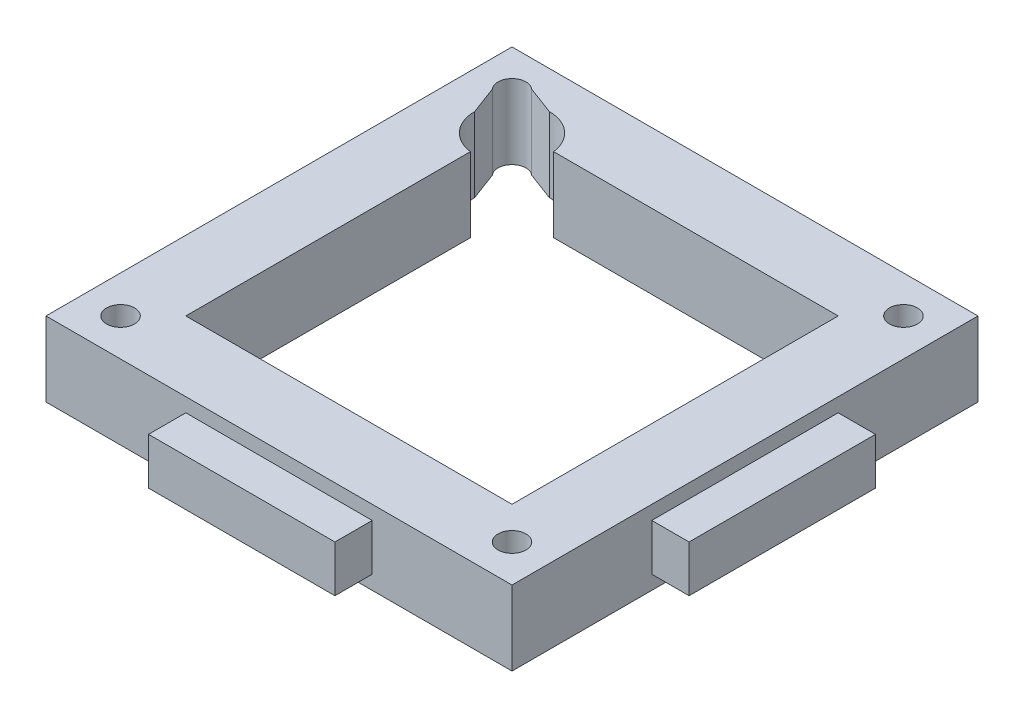
ISO-10303-21;
HEADER;
FILE_DESCRIPTION(('STEP AP214'),'2;1');
FILE_NAME('part.step','',(''),(''),'','','');
FILE_SCHEMA(('AUTOMOTIVE_DESIGN { 1 0 10303 214 1 1 1 1 }'));
ENDSEC;
DATA;
#1=APPLICATION_CONTEXT('core data for automotive mechanical design processes');
#2=APPLICATION_PROTOCOL_DEFINITION('international standard','automotive_design',2000,#1);
#3=PRODUCT_CONTEXT('',#1,'mechanical');
#4=PRODUCT('Part','Part','',(#3));
#5=PRODUCT_RELATED_PRODUCT_CATEGORY('part','',(#4));
#6=PRODUCT_DEFINITION_FORMATION('','',#4);
#7=PRODUCT_DEFINITION_CONTEXT('part definition',#1,'design');
#8=PRODUCT_DEFINITION('design','',#6,#7);
#9=PRODUCT_DEFINITION_SHAPE('','',#8);
#10=(LENGTH_UNIT() NAMED_UNIT(*) SI_UNIT(.MILLI.,.METRE.));
#11=(NAMED_UNIT(*) PLANE_ANGLE_UNIT() SI_UNIT($,.RADIAN.));
#12=(NAMED_UNIT(*) SI_UNIT($,.STERADIAN.) SOLID_ANGLE_UNIT());
#13=UNCERTAINTY_MEASURE_WITH_UNIT(LENGTH_MEASURE(1.E-05),#10,'distance_accuracy_value','');
#14=(GEOMETRIC_REPRESENTATION_CONTEXT(3) GLOBAL_UNCERTAINTY_ASSIGNED_CONTEXT((#13)) GLOBAL_UNIT_ASSIGNED_CONTEXT((#10,
#11,#12)) REPRESENTATION_CONTEXT('',''));
#15=CARTESIAN_POINT('',(0.,0.,0.));
#16=DIRECTION('',(0.,0.,1.));
#17=DIRECTION('',(1.,0.,0.));
#18=AXIS2_PLACEMENT_3D('',#15,#16,#17);
#19=CARTESIAN_POINT('',(25.,8.,0.));
#20=DIRECTION('',(-1.,0.,0.));
#21=DIRECTION('',(0.,0.,1.));
#22=AXIS2_PLACEMENT_3D('',#19,#20,#21);
#23=PLANE('',#22);
#24=DIRECTION('',(0.,0.,-1.));
#25=VECTOR('',#24,1.);
#26=CARTESIAN_POINT('',(25.,0.,0.));
#27=LINE('',#26,#25);
#28=CARTESIAN_POINT('',(25.,0.,25.));
#29=VERTEX_POINT('',#28);
#30=CARTESIAN_POINT('',(25.,0.,-25.));
#31=VERTEX_POINT('',#30);
#32=EDGE_CURVE('E438',#29,#31,#27,.T.);
#33=ORIENTED_EDGE('',*,*,#32,.T.);
#34=DIRECTION('',(0.,-1.,0.));
#35=VECTOR('',#34,1.);
#36=CARTESIAN_POINT('',(25.,8.,-25.));
#37=LINE('',#36,#35);
#38=CARTESIAN_POINT('',(25.,8.,-25.));
#39=VERTEX_POINT('',#38);
#40=EDGE_CURVE('E59',#39,#31,#37,.T.);
#41=ORIENTED_EDGE('',*,*,#40,.F.);
#42=DIRECTION('',(0.,0.,-1.));
#43=VECTOR('',#42,1.);
#44=CARTESIAN_POINT('',(25.,8.,0.));
#45=LINE('',#44,#43);
#46=CARTESIAN_POINT('',(25.,8.,25.));
#47=VERTEX_POINT('',#46);
#48=EDGE_CURVE('E378',#47,#39,#45,.T.);
#49=ORIENTED_EDGE('',*,*,#48,.F.);
#50=DIRECTION('',(0.,-1.,0.));
#51=VECTOR('',#50,1.);
#52=CARTESIAN_POINT('',(25.,8.,25.));
#53=LINE('',#52,#51);
#54=EDGE_CURVE('E11',#47,#29,#53,.T.);
#55=ORIENTED_EDGE('',*,*,#54,.T.);
#56=EDGE_LOOP('',(#33,#41,#49,#55));
#57=FACE_BOUND('',#56,.T.);
#58=DIRECTION('',(0.,0.,-1.));
#59=VECTOR('',#58,1.);
#60=CARTESIAN_POINT('',(25.,1.50000000000004,0.));
#61=LINE('',#60,#59);
#62=CARTESIAN_POINT('',(25.,1.5,10.));
#63=VERTEX_POINT('',#62);
#64=CARTESIAN_POINT('',(25.,1.50000000000007,-10.));
#65=VERTEX_POINT('',#64);
#66=EDGE_CURVE('E67',#63,#65,#61,.T.);
#67=ORIENTED_EDGE('',*,*,#66,.F.);
#68=DIRECTION('',(0.,-1.,0.));
#69=VECTOR('',#68,1.);
#70=CARTESIAN_POINT('',(25.,8.,10.));
#71=LINE('',#70,#69);
#72=CARTESIAN_POINT('',(25.,6.5,10.));
#73=VERTEX_POINT('',#72);
#74=EDGE_CURVE('E71',#73,#63,#71,.T.);
#75=ORIENTED_EDGE('',*,*,#74,.F.);
#76=DIRECTION('',(0.,0.,1.));
#77=VECTOR('',#76,1.);
#78=CARTESIAN_POINT('',(25.,6.5,0.));
#79=LINE('',#78,#77);
#80=CARTESIAN_POINT('',(25.,6.5,-10.));
#81=VERTEX_POINT('',#80);
#82=EDGE_CURVE('E1005',#81,#73,#79,.T.);
#83=ORIENTED_EDGE('',*,*,#82,.F.);
#84=DIRECTION('',(0.,1.,0.));
#85=VECTOR('',#84,1.);
#86=CARTESIAN_POINT('',(25.,8.,-10.));
#87=LINE('',#86,#85);
#88=EDGE_CURVE('E1015',#65,#81,#87,.T.);
#89=ORIENTED_EDGE('',*,*,#88,.F.);
#90=EDGE_LOOP('',(#67,#75,#83,#89));
#91=FACE_BOUND('',#90,.T.);
#92=ADVANCED_FACE('F49',(#57,#91),#23,.F.);
#93=CARTESIAN_POINT('',(0.,8.,25.));
#94=DIRECTION('',(0.,0.,-1.));
#95=DIRECTION('',(-1.,0.,0.));
#96=AXIS2_PLACEMENT_3D('',#93,#94,#95);
#97=PLANE('',#96);
#98=DIRECTION('',(1.,0.,0.));
#99=VECTOR('',#98,1.);
#100=CARTESIAN_POINT('',(0.,0.,25.));
#101=LINE('',#100,#99);
#102=CARTESIAN_POINT('',(-25.,0.,25.));
#103=VERTEX_POINT('',#102);
#104=EDGE_CURVE('E434',#103,#29,#101,.T.);
#105=ORIENTED_EDGE('',*,*,#104,.T.);
#106=ORIENTED_EDGE('',*,*,#54,.F.);
#107=DIRECTION('',(1.,0.,0.));
#108=VECTOR('',#107,1.);
#109=CARTESIAN_POINT('',(0.,8.,25.));
#110=LINE('',#109,#108);
#111=CARTESIAN_POINT('',(-25.,8.,25.));
#112=VERTEX_POINT('',#111);
#113=EDGE_CURVE('E374',#112,#47,#110,.T.);
#114=ORIENTED_EDGE('',*,*,#113,.F.);
#115=DIRECTION('',(0.,-1.,0.));
#116=VECTOR('',#115,1.);
#117=CARTESIAN_POINT('',(-25.,8.,25.));
#118=LINE('',#117,#116);
#119=EDGE_CURVE('E457',#112,#103,#118,.T.);
#120=ORIENTED_EDGE('',*,*,#119,.T.);
#121=EDGE_LOOP('',(#105,#106,#114,#120));
#122=FACE_BOUND('',#121,.T.);
#123=DIRECTION('',(1.,0.,0.));
#124=VECTOR('',#123,1.);
#125=CARTESIAN_POINT('',(0.,1.5000000000053,25.));
#126=LINE('',#125,#124);
#127=CARTESIAN_POINT('',(-10.0000000000553,1.5000000000053,25.));
#128=VERTEX_POINT('',#127);
#129=CARTESIAN_POINT('',(9.9999999999447,1.5000000000053,25.));
#130=VERTEX_POINT('',#129);
#131=EDGE_CURVE('E242',#128,#130,#126,.T.);
#132=ORIENTED_EDGE('',*,*,#131,.F.);
#133=DIRECTION('',(0.,-1.,0.));
#134=VECTOR('',#133,1.);
#135=CARTESIAN_POINT('',(-10.0000000000553,8.,25.));
#136=LINE('',#135,#134);
#137=CARTESIAN_POINT('',(-10.0000000000553,6.5000000000053,25.));
#138=VERTEX_POINT('',#137);
#139=EDGE_CURVE('E258',#138,#128,#136,.T.);
#140=ORIENTED_EDGE('',*,*,#139,.F.);
#141=DIRECTION('',(-1.,0.,0.));
#142=VECTOR('',#141,1.);
#143=CARTESIAN_POINT('',(0.,6.5000000000053,25.));
#144=LINE('',#143,#142);
#145=CARTESIAN_POINT('',(9.9999999999447,6.5000000000053,25.));
#146=VERTEX_POINT('',#145);
#147=EDGE_CURVE('E271',#146,#138,#144,.T.);
#148=ORIENTED_EDGE('',*,*,#147,.F.);
#149=DIRECTION('',(0.,1.,0.));
#150=VECTOR('',#149,1.);
#151=CARTESIAN_POINT('',(9.9999999999447,8.,25.));
#152=LINE('',#151,#150);
#153=EDGE_CURVE('E247',#130,#146,#152,.T.);
#154=ORIENTED_EDGE('',*,*,#153,.F.);
#155=EDGE_LOOP('',(#132,#140,#148,#154));
#156=FACE_BOUND('',#155,.T.);
#157=ADVANCED_FACE('F545',(#122,#156),#97,.F.);
#158=CARTESIAN_POINT('',(0.,8.,-25.));
#159=DIRECTION('',(0.,0.,-1.));
#160=DIRECTION('',(-1.,0.,0.));
#161=AXIS2_PLACEMENT_3D('',#158,#159,#160);
#162=PLANE('',#161);
#163=DIRECTION('',(1.,0.,0.));
#164=VECTOR('',#163,1.);
#165=CARTESIAN_POINT('',(0.,6.5000000000053,-25.));
#166=LINE('',#165,#164);
#167=CARTESIAN_POINT('',(-10.0000000000553,6.5000000000053,-25.));
#168=VERTEX_POINT('',#167);
#169=CARTESIAN_POINT('',(9.9999999999447,6.5000000000053,-25.));
#170=VERTEX_POINT('',#169);
#171=EDGE_CURVE('E293',#168,#170,#166,.T.);
#172=ORIENTED_EDGE('',*,*,#171,.F.);
#173=DIRECTION('',(0.,1.,0.));
#174=VECTOR('',#173,1.);
#175=CARTESIAN_POINT('',(-10.0000000000553,8.,-25.));
#176=LINE('',#175,#174);
#177=CARTESIAN_POINT('',(-10.0000000000553,1.5000000000053,-25.));
#178=VERTEX_POINT('',#177);
#179=EDGE_CURVE('E299',#178,#168,#176,.T.);
#180=ORIENTED_EDGE('',*,*,#179,.F.);
#181=DIRECTION('',(-1.,0.,0.));
#182=VECTOR('',#181,1.);
#183=CARTESIAN_POINT('',(0.,1.5000000000053,-25.));
#184=LINE('',#183,#182);
#185=CARTESIAN_POINT('',(9.9999999999447,1.5000000000053,-25.));
#186=VERTEX_POINT('',#185);
#187=EDGE_CURVE('E318',#186,#178,#184,.T.);
#188=ORIENTED_EDGE('',*,*,#187,.F.);
#189=DIRECTION('',(0.,-1.,0.));
#190=VECTOR('',#189,1.);
#191=CARTESIAN_POINT('',(9.9999999999447,8.,-25.));
#192=LINE('',#191,#190);
#193=EDGE_CURVE('E314',#170,#186,#192,.T.);
#194=ORIENTED_EDGE('',*,*,#193,.F.);
#195=EDGE_LOOP('',(#172,#180,#188,#194));
#196=FACE_BOUND('',#195,.T.);
#197=DIRECTION('',(1.,0.,0.));
#198=VECTOR('',#197,1.);
#199=CARTESIAN_POINT('',(0.,0.,-25.));
#200=LINE('',#199,#198);
#201=CARTESIAN_POINT('',(-25.,0.,-25.));
#202=VERTEX_POINT('',#201);
#203=EDGE_CURVE('E442',#202,#31,#200,.T.);
#204=ORIENTED_EDGE('',*,*,#203,.F.);
#205=DIRECTION('',(0.,-1.,0.));
#206=VECTOR('',#205,1.);
#207=CARTESIAN_POINT('',(-25.,8.,-25.));
#208=LINE('',#207,#206);
#209=CARTESIAN_POINT('',(-25.,8.,-25.));
#210=VERTEX_POINT('',#209);
#211=EDGE_CURVE('E460',#210,#202,#208,.T.);
#212=ORIENTED_EDGE('',*,*,#211,.F.);
#213=DIRECTION('',(1.,0.,0.));
#214=VECTOR('',#213,1.);
#215=CARTESIAN_POINT('',(0.,8.,-25.));
#216=LINE('',#215,#214);
#217=EDGE_CURVE('E381',#210,#39,#216,.T.);
#218=ORIENTED_EDGE('',*,*,#217,.T.);
#219=ORIENTED_EDGE('',*,*,#40,.T.);
#220=EDGE_LOOP('',(#204,#212,#218,#219));
#221=FACE_BOUND('',#220,.T.);
#222=ADVANCED_FACE('F543',(#196,#221),#162,.T.);
#223=CARTESIAN_POINT('',(-17.,8.,-17.));
#224=DIRECTION('',(0.,-1.,0.));
#225=DIRECTION('',(0.,0.,-1.));
#226=AXIS2_PLACEMENT_3D('',#223,#224,#225);
#227=CYLINDRICAL_SURFACE('',#226,4.);
#228=CARTESIAN_POINT('',(-17.,0.,-17.));
#229=DIRECTION('',(0.,1.,0.));
#230=DIRECTION('',(0.,0.,1.));
#231=AXIS2_PLACEMENT_3D('',#228,#229,#230);
#232=CIRCLE('',#231,4.);
#233=CARTESIAN_POINT('',(-13.0313730334031,0.,-17.5));
#234=VERTEX_POINT('',#233);
#235=CARTESIAN_POINT('',(-17.,0.,-21.));
#236=VERTEX_POINT('',#235);
#237=EDGE_CURVE('E328',#234,#236,#232,.T.);
#238=ORIENTED_EDGE('',*,*,#237,.F.);
#239=DIRECTION('',(0.,-1.,0.));
#240=VECTOR('',#239,1.);
#241=CARTESIAN_POINT('',(-13.0313730334031,8.,-17.5));
#242=LINE('',#241,#240);
#243=CARTESIAN_POINT('',(-13.0313730334031,8.,-17.5));
#244=VERTEX_POINT('',#243);
#245=EDGE_CURVE('E53',#244,#234,#242,.T.);
#246=ORIENTED_EDGE('',*,*,#245,.F.);
#247=CARTESIAN_POINT('',(-17.,8.,-17.));
#248=DIRECTION('',(0.,1.,0.));
#249=DIRECTION('',(0.,0.,1.));
#250=AXIS2_PLACEMENT_3D('',#247,#248,#249);
#251=CIRCLE('',#250,4.);
#252=CARTESIAN_POINT('',(-17.,8.,-21.));
#253=VERTEX_POINT('',#252);
#254=EDGE_CURVE('E338',#244,#253,#251,.T.);
#255=ORIENTED_EDGE('',*,*,#254,.T.);
#256=DIRECTION('',(0.,-1.,0.));
#257=VECTOR('',#256,1.);
#258=CARTESIAN_POINT('',(-17.,8.,-21.));
#259=LINE('',#258,#257);
#260=EDGE_CURVE('E397',#253,#236,#259,.T.);
#261=ORIENTED_EDGE('',*,*,#260,.T.);
#262=EDGE_LOOP('',(#238,#246,#255,#261));
#263=FACE_BOUND('',#262,.T.);
#264=ADVANCED_FACE('F495',(#263),#227,.F.);
#265=CARTESIAN_POINT('',(0.,8.,-17.5));
#266=DIRECTION('',(0.,0.,1.));
#267=DIRECTION('',(1.,0.,0.));
#268=AXIS2_PLACEMENT_3D('',#265,#266,#267);
#269=PLANE('',#268);
#270=DIRECTION('',(-1.,0.,0.));
#271=VECTOR('',#270,1.);
#272=CARTESIAN_POINT('',(0.,0.,-17.5));
#273=LINE('',#272,#271);
#274=CARTESIAN_POINT('',(17.5,0.,-17.5));
#275=VERTEX_POINT('',#274);
#276=EDGE_CURVE('E401',#275,#234,#273,.T.);
#277=ORIENTED_EDGE('',*,*,#276,.F.);
#278=DIRECTION('',(0.,-1.,0.));
#279=VECTOR('',#278,1.);
#280=CARTESIAN_POINT('',(17.5,8.,-17.5));
#281=LINE('',#280,#279);
#282=CARTESIAN_POINT('',(17.5,8.,-17.5));
#283=VERTEX_POINT('',#282);
#284=EDGE_CURVE('E484',#283,#275,#281,.T.);
#285=ORIENTED_EDGE('',*,*,#284,.F.);
#286=DIRECTION('',(-1.,0.,0.));
#287=VECTOR('',#286,1.);
#288=CARTESIAN_POINT('',(0.,8.,-17.5));
#289=LINE('',#288,#287);
#290=EDGE_CURVE('E342',#283,#244,#289,.T.);
#291=ORIENTED_EDGE('',*,*,#290,.T.);
#292=ORIENTED_EDGE('',*,*,#245,.T.);
#293=EDGE_LOOP('',(#277,#285,#291,#292));
#294=FACE_BOUND('',#293,.T.);
#295=ADVANCED_FACE('F51',(#294),#269,.T.);
#296=CARTESIAN_POINT('',(17.5,8.,0.));
#297=DIRECTION('',(-1.,0.,0.));
#298=DIRECTION('',(0.,0.,1.));
#299=AXIS2_PLACEMENT_3D('',#296,#297,#298);
#300=PLANE('',#299);
#301=DIRECTION('',(0.,0.,-1.));
#302=VECTOR('',#301,1.);
#303=CARTESIAN_POINT('',(17.5,0.,0.));
#304=LINE('',#303,#302);
#305=CARTESIAN_POINT('',(17.5,0.,17.5));
#306=VERTEX_POINT('',#305);
#307=EDGE_CURVE('E406',#306,#275,#304,.T.);
#308=ORIENTED_EDGE('',*,*,#307,.F.);
#309=DIRECTION('',(0.,-1.,0.));
#310=VECTOR('',#309,1.);
#311=CARTESIAN_POINT('',(17.5,8.,17.5));
#312=LINE('',#311,#310);
#313=CARTESIAN_POINT('',(17.5,8.,17.5));
#314=VERTEX_POINT('',#313);
#315=EDGE_CURVE('E482',#314,#306,#312,.T.);
#316=ORIENTED_EDGE('',*,*,#315,.F.);
#317=DIRECTION('',(0.,0.,-1.));
#318=VECTOR('',#317,1.);
#319=CARTESIAN_POINT('',(17.5,8.,0.));
#320=LINE('',#319,#318);
#321=EDGE_CURVE('E348',#314,#283,#320,.T.);
#322=ORIENTED_EDGE('',*,*,#321,.T.);
#323=ORIENTED_EDGE('',*,*,#284,.T.);
#324=EDGE_LOOP('',(#308,#316,#322,#323));
#325=FACE_BOUND('',#324,.T.);
#326=ADVANCED_FACE('F503',(#325),#300,.T.);
#327=CARTESIAN_POINT('',(0.,8.,17.5));
#328=DIRECTION('',(0.,0.,-1.));
#329=DIRECTION('',(-1.,0.,0.));
#330=AXIS2_PLACEMENT_3D('',#327,#328,#329);
#331=PLANE('',#330);
#332=DIRECTION('',(1.,0.,0.));
#333=VECTOR('',#332,1.);
#334=CARTESIAN_POINT('',(0.,0.,17.5));
#335=LINE('',#334,#333);
#336=CARTESIAN_POINT('',(-17.5,0.,17.5));
#337=VERTEX_POINT('',#336);
#338=EDGE_CURVE('E410',#337,#306,#335,.T.);
#339=ORIENTED_EDGE('',*,*,#338,.F.);
#340=DIRECTION('',(0.,-1.,0.));
#341=VECTOR('',#340,1.);
#342=CARTESIAN_POINT('',(-17.5,8.,17.5));
#343=LINE('',#342,#341);
#344=CARTESIAN_POINT('',(-17.5,8.,17.5));
#345=VERTEX_POINT('',#344);
#346=EDGE_CURVE('E479',#345,#337,#343,.T.);
#347=ORIENTED_EDGE('',*,*,#346,.F.);
#348=DIRECTION('',(1.,0.,0.));
#349=VECTOR('',#348,1.);
#350=CARTESIAN_POINT('',(0.,8.,17.5));
#351=LINE('',#350,#349);
#352=EDGE_CURVE('E352',#345,#314,#351,.T.);
#353=ORIENTED_EDGE('',*,*,#352,.T.);
#354=ORIENTED_EDGE('',*,*,#315,.T.);
#355=EDGE_LOOP('',(#339,#347,#353,#354));
#356=FACE_BOUND('',#355,.T.);
#357=ADVANCED_FACE('F510',(#356),#331,.T.);
#358=CARTESIAN_POINT('',(-17.5,8.,0.));
#359=DIRECTION('',(-1.,0.,0.));
#360=DIRECTION('',(0.,0.,1.));
#361=AXIS2_PLACEMENT_3D('',#358,#359,#360);
#362=PLANE('',#361);
#363=DIRECTION('',(0.,0.,-1.));
#364=VECTOR('',#363,1.);
#365=CARTESIAN_POINT('',(-17.5,0.,0.));
#366=LINE('',#365,#364);
#367=CARTESIAN_POINT('',(-17.5,0.,-13.0313730334031));
#368=VERTEX_POINT('',#367);
#369=EDGE_CURVE('E414',#337,#368,#366,.T.);
#370=ORIENTED_EDGE('',*,*,#369,.T.);
#371=DIRECTION('',(0.,-1.,0.));
#372=VECTOR('',#371,1.);
#373=CARTESIAN_POINT('',(-17.5,8.,-13.0313730334031));
#374=LINE('',#373,#372);
#375=CARTESIAN_POINT('',(-17.5,8.,-13.0313730334031));
#376=VERTEX_POINT('',#375);
#377=EDGE_CURVE('E476',#376,#368,#374,.T.);
#378=ORIENTED_EDGE('',*,*,#377,.F.);
#379=DIRECTION('',(0.,0.,-1.));
#380=VECTOR('',#379,1.);
#381=CARTESIAN_POINT('',(-17.5,8.,0.));
#382=LINE('',#381,#380);
#383=EDGE_CURVE('E356',#345,#376,#382,.T.);
#384=ORIENTED_EDGE('',*,*,#383,.F.);
#385=ORIENTED_EDGE('',*,*,#346,.T.);
#386=EDGE_LOOP('',(#370,#378,#384,#385));
#387=FACE_BOUND('',#386,.T.);
#388=ADVANCED_FACE('F514',(#387),#362,.F.);
#389=CARTESIAN_POINT('',(-21.,0.,-17.));
#390=VERTEX_POINT('',#389);
#391=EDGE_CURVE('E402',#390,#368,#232,.T.);
#392=ORIENTED_EDGE('',*,*,#391,.F.);
#393=DIRECTION('',(0.,-1.,0.));
#394=VECTOR('',#393,1.);
#395=CARTESIAN_POINT('',(-21.,8.,-17.));
#396=LINE('',#395,#394);
#397=CARTESIAN_POINT('',(-21.,8.,-17.));
#398=VERTEX_POINT('',#397);
#399=EDGE_CURVE('E473',#398,#390,#396,.T.);
#400=ORIENTED_EDGE('',*,*,#399,.F.);
#401=EDGE_CURVE('E344',#398,#376,#251,.T.);
#402=ORIENTED_EDGE('',*,*,#401,.T.);
#403=ORIENTED_EDGE('',*,*,#377,.T.);
#404=EDGE_LOOP('',(#392,#400,#402,#403));
#405=FACE_BOUND('',#404,.T.);
#406=ADVANCED_FACE('F533',(#405),#227,.F.);
#407=CARTESIAN_POINT('',(-12.8219178082192,8.,4.80821917808219));
#408=DIRECTION('',(0.936329177569045,0.,-0.351123441588392));
#409=DIRECTION('',(-0.351123441588392,0.,-0.936329177569045));
#410=AXIS2_PLACEMENT_3D('',#407,#408,#409);
#411=PLANE('',#410);
#412=DIRECTION('',(0.351123441588392,0.,0.936329177569044));
#413=VECTOR('',#412,1.);
#414=CARTESIAN_POINT('',(-12.8219178082192,0.,4.80821917808219));
#415=LINE('',#414,#413);
#416=CARTESIAN_POINT('',(-22.1301369863014,0.,-20.013698630137));
#417=VERTEX_POINT('',#416);
#418=EDGE_CURVE('E418',#417,#390,#415,.T.);
#419=ORIENTED_EDGE('',*,*,#418,.F.);
#420=DIRECTION('',(0.,-1.,0.));
#421=VECTOR('',#420,1.);
#422=CARTESIAN_POINT('',(-22.1301369863014,8.,-20.013698630137));
#423=LINE('',#422,#421);
#424=CARTESIAN_POINT('',(-22.1301369863014,8.,-20.013698630137));
#425=VERTEX_POINT('',#424);
#426=EDGE_CURVE('E470',#425,#417,#423,.T.);
#427=ORIENTED_EDGE('',*,*,#426,.F.);
#428=DIRECTION('',(0.351123441588392,0.,0.936329177569044));
#429=VECTOR('',#428,1.);
#430=CARTESIAN_POINT('',(-12.8219178082192,8.,4.80821917808219));
#431=LINE('',#430,#429);
#432=EDGE_CURVE('E359',#425,#398,#431,.T.);
#433=ORIENTED_EDGE('',*,*,#432,.T.);
#434=ORIENTED_EDGE('',*,*,#399,.T.);
#435=EDGE_LOOP('',(#419,#427,#433,#434));
#436=FACE_BOUND('',#435,.T.);
#437=ADVANCED_FACE('F523',(#436),#411,.T.);
#438=CARTESIAN_POINT('',(-21.,8.,-21.));
#439=DIRECTION('',(0.,-1.,0.));
#440=DIRECTION('',(0.,0.,-1.));
#441=AXIS2_PLACEMENT_3D('',#438,#439,#440);
#442=CYLINDRICAL_SURFACE('',#441,1.5);
#443=CARTESIAN_POINT('',(-21.,0.,-21.));
#444=DIRECTION('',(0.,1.,0.));
#445=DIRECTION('',(0.,0.,1.));
#446=AXIS2_PLACEMENT_3D('',#443,#444,#445);
#447=CIRCLE('',#446,1.5);
#448=CARTESIAN_POINT('',(-20.013698630137,0.,-22.1301369863014));
#449=VERTEX_POINT('',#448);
#450=EDGE_CURVE('E422',#449,#417,#447,.T.);
#451=ORIENTED_EDGE('',*,*,#450,.F.);
#452=DIRECTION('',(0.,-1.,0.));
#453=VECTOR('',#452,1.);
#454=CARTESIAN_POINT('',(-20.013698630137,8.,-22.1301369863014));
#455=LINE('',#454,#453);
#456=CARTESIAN_POINT('',(-20.013698630137,8.,-22.1301369863014));
#457=VERTEX_POINT('',#456);
#458=EDGE_CURVE('E467',#457,#449,#455,.T.);
#459=ORIENTED_EDGE('',*,*,#458,.F.);
#460=CARTESIAN_POINT('',(-21.,8.,-21.));
#461=DIRECTION('',(0.,1.,0.));
#462=DIRECTION('',(0.,0.,1.));
#463=AXIS2_PLACEMENT_3D('',#460,#461,#462);
#464=CIRCLE('',#463,1.5);
#465=EDGE_CURVE('E363',#457,#425,#464,.T.);
#466=ORIENTED_EDGE('',*,*,#465,.T.);
#467=ORIENTED_EDGE('',*,*,#426,.T.);
#468=EDGE_LOOP('',(#451,#459,#466,#467));
#469=FACE_BOUND('',#468,.T.);
#470=ADVANCED_FACE('F527',(#469),#442,.F.);
#471=CARTESIAN_POINT('',(21.,8.,21.));
#472=DIRECTION('',(0.,-1.,0.));
#473=DIRECTION('',(0.,0.,-1.));
#474=AXIS2_PLACEMENT_3D('',#471,#472,#473);
#475=CYLINDRICAL_SURFACE('',#474,1.5);
#476=CARTESIAN_POINT('',(21.,8.,21.));
#477=DIRECTION('',(0.,1.,0.));
#478=DIRECTION('',(0.,0.,1.));
#479=AXIS2_PLACEMENT_3D('',#476,#477,#478);
#480=CIRCLE('',#479,1.5);
#481=CARTESIAN_POINT('',(21.,8.,22.5));
#482=VERTEX_POINT('',#481);
#483=EDGE_CURVE('E389',#482,#482,#480,.T.);
#484=ORIENTED_EDGE('',*,*,#483,.T.);
#485=EDGE_LOOP('',(#484));
#486=FACE_BOUND('',#485,.T.);
#487=CARTESIAN_POINT('',(21.,0.,21.));
#488=DIRECTION('',(0.,1.,0.));
#489=DIRECTION('',(0.,0.,1.));
#490=AXIS2_PLACEMENT_3D('',#487,#488,#489);
#491=CIRCLE('',#490,1.5);
#492=CARTESIAN_POINT('',(21.,0.,22.5));
#493=VERTEX_POINT('',#492);
#494=EDGE_CURVE('E450',#493,#493,#491,.T.);
#495=ORIENTED_EDGE('',*,*,#494,.F.);
#496=EDGE_LOOP('',(#495));
#497=FACE_BOUND('',#496,.T.);
#498=ADVANCED_FACE('F567',(#486,#497),#475,.F.);
#499=CARTESIAN_POINT('',(-25.,8.,0.));
#500=DIRECTION('',(-1.,0.,0.));
#501=DIRECTION('',(0.,0.,1.));
#502=AXIS2_PLACEMENT_3D('',#499,#500,#501);
#503=PLANE('',#502);
#504=DIRECTION('',(0.,0.,-1.));
#505=VECTOR('',#504,1.);
#506=CARTESIAN_POINT('',(-25.,0.,0.));
#507=LINE('',#506,#505);
#508=EDGE_CURVE('E446',#103,#202,#507,.T.);
#509=ORIENTED_EDGE('',*,*,#508,.F.);
#510=ORIENTED_EDGE('',*,*,#119,.F.);
#511=DIRECTION('',(0.,0.,-1.));
#512=VECTOR('',#511,1.);
#513=CARTESIAN_POINT('',(-25.,8.,0.));
#514=LINE('',#513,#512);
#515=EDGE_CURVE('E385',#112,#210,#514,.T.);
#516=ORIENTED_EDGE('',*,*,#515,.T.);
#517=ORIENTED_EDGE('',*,*,#211,.T.);
#518=EDGE_LOOP('',(#509,#510,#516,#517));
#519=FACE_BOUND('',#518,.T.);
#520=ADVANCED_FACE('F561',(#519),#503,.T.);
#521=CARTESIAN_POINT('',(21.,8.,-21.));
#522=DIRECTION('',(0.,-1.,0.));
#523=DIRECTION('',(0.,0.,-1.));
#524=AXIS2_PLACEMENT_3D('',#521,#522,#523);
#525=CYLINDRICAL_SURFACE('',#524,1.5);
#526=CARTESIAN_POINT('',(21.,8.,-21.));
#527=DIRECTION('',(0.,1.,0.));
#528=DIRECTION('',(0.,0.,1.));
#529=AXIS2_PLACEMENT_3D('',#526,#527,#528);
#530=CIRCLE('',#529,1.5);
#531=CARTESIAN_POINT('',(21.,8.,-19.5));
#532=VERTEX_POINT('',#531);
#533=EDGE_CURVE('E370',#532,#532,#530,.F.);
#534=ORIENTED_EDGE('',*,*,#533,.F.);
#535=EDGE_LOOP('',(#534));
#536=FACE_BOUND('',#535,.T.);
#537=CARTESIAN_POINT('',(21.,0.,-21.));
#538=DIRECTION('',(0.,1.,0.));
#539=DIRECTION('',(0.,0.,1.));
#540=AXIS2_PLACEMENT_3D('',#537,#538,#539);
#541=CIRCLE('',#540,1.5);
#542=CARTESIAN_POINT('',(21.,0.,-19.5));
#543=VERTEX_POINT('',#542);
#544=EDGE_CURVE('E430',#543,#543,#541,.F.);
#545=ORIENTED_EDGE('',*,*,#544,.T.);
#546=EDGE_LOOP('',(#545));
#547=FACE_BOUND('',#546,.T.);
#548=ADVANCED_FACE('F558',(#536,#547),#525,.F.);
#549=CARTESIAN_POINT('',(4.80821917808219,8.,-12.8219178082192));
#550=DIRECTION('',(0.351123441588392,0.,-0.936329177569045));
#551=DIRECTION('',(-0.936329177569045,0.,-0.351123441588392));
#552=AXIS2_PLACEMENT_3D('',#549,#550,#551);
#553=PLANE('',#552);
#554=DIRECTION('',(0.936329177569044,0.,0.351123441588392));
#555=VECTOR('',#554,1.);
#556=CARTESIAN_POINT('',(4.80821917808219,0.,-12.8219178082192));
#557=LINE('',#556,#555);
#558=EDGE_CURVE('E426',#449,#236,#557,.T.);
#559=ORIENTED_EDGE('',*,*,#558,.T.);
#560=ORIENTED_EDGE('',*,*,#260,.F.);
#561=DIRECTION('',(0.936329177569044,0.,0.351123441588392));
#562=VECTOR('',#561,1.);
#563=CARTESIAN_POINT('',(4.80821917808219,8.,-12.8219178082192));
#564=LINE('',#563,#562);
#565=EDGE_CURVE('E367',#457,#253,#564,.T.);
#566=ORIENTED_EDGE('',*,*,#565,.F.);
#567=ORIENTED_EDGE('',*,*,#458,.T.);
#568=EDGE_LOOP('',(#559,#560,#566,#567));
#569=FACE_BOUND('',#568,.T.);
#570=ADVANCED_FACE('F530',(#569),#553,.F.);
#571=CARTESIAN_POINT('',(-21.,8.,21.));
#572=DIRECTION('',(0.,-1.,0.));
#573=DIRECTION('',(0.,0.,-1.));
#574=AXIS2_PLACEMENT_3D('',#571,#572,#573);
#575=CYLINDRICAL_SURFACE('',#574,1.5);
#576=CARTESIAN_POINT('',(-21.,8.,21.));
#577=DIRECTION('',(0.,1.,0.));
#578=DIRECTION('',(0.,0.,1.));
#579=AXIS2_PLACEMENT_3D('',#576,#577,#578);
#580=CIRCLE('',#579,1.5);
#581=CARTESIAN_POINT('',(-21.,8.,22.5));
#582=VERTEX_POINT('',#581);
#583=EDGE_CURVE('E393',#582,#582,#580,.F.);
#584=ORIENTED_EDGE('',*,*,#583,.F.);
#585=EDGE_LOOP('',(#584));
#586=FACE_BOUND('',#585,.T.);
#587=CARTESIAN_POINT('',(-21.,0.,21.));
#588=DIRECTION('',(0.,1.,0.));
#589=DIRECTION('',(0.,0.,1.));
#590=AXIS2_PLACEMENT_3D('',#587,#588,#589);
#591=CIRCLE('',#590,1.5);
#592=CARTESIAN_POINT('',(-21.,0.,22.5));
#593=VERTEX_POINT('',#592);
#594=EDGE_CURVE('E343',#593,#593,#591,.F.);
#595=ORIENTED_EDGE('',*,*,#594,.T.);
#596=EDGE_LOOP('',(#595));
#597=FACE_BOUND('',#596,.T.);
#598=ADVANCED_FACE('F565',(#586,#597),#575,.F.);
#599=CARTESIAN_POINT('',(0.,8.,0.));
#600=DIRECTION('',(0.,1.,0.));
#601=DIRECTION('',(0.,0.,1.));
#602=AXIS2_PLACEMENT_3D('',#599,#600,#601);
#603=PLANE('',#602);
#604=ORIENTED_EDGE('',*,*,#254,.F.);
#605=ORIENTED_EDGE('',*,*,#290,.F.);
#606=ORIENTED_EDGE('',*,*,#321,.F.);
#607=ORIENTED_EDGE('',*,*,#352,.F.);
#608=ORIENTED_EDGE('',*,*,#383,.T.);
#609=ORIENTED_EDGE('',*,*,#401,.F.);
#610=ORIENTED_EDGE('',*,*,#432,.F.);
#611=ORIENTED_EDGE('',*,*,#465,.F.);
#612=ORIENTED_EDGE('',*,*,#565,.T.);
#613=EDGE_LOOP('',(#604,#605,#606,#607,#608,#609,#610,#611,#612));
#614=FACE_BOUND('',#613,.T.);
#615=ORIENTED_EDGE('',*,*,#533,.T.);
#616=EDGE_LOOP('',(#615));
#617=FACE_BOUND('',#616,.T.);
#618=ORIENTED_EDGE('',*,*,#113,.T.);
#619=ORIENTED_EDGE('',*,*,#48,.T.);
#620=ORIENTED_EDGE('',*,*,#217,.F.);
#621=ORIENTED_EDGE('',*,*,#515,.F.);
#622=EDGE_LOOP('',(#618,#619,#620,#621));
#623=FACE_BOUND('',#622,.T.);
#624=ORIENTED_EDGE('',*,*,#483,.F.);
#625=EDGE_LOOP('',(#624));
#626=FACE_BOUND('',#625,.T.);
#627=ORIENTED_EDGE('',*,*,#583,.T.);
#628=EDGE_LOOP('',(#627));
#629=FACE_BOUND('',#628,.T.);
#630=ADVANCED_FACE('F508',(#614,#617,#623,#626,#629),#603,.T.);
#631=CARTESIAN_POINT('',(0.,0.,0.));
#632=DIRECTION('',(0.,1.,0.));
#633=DIRECTION('',(0.,0.,1.));
#634=AXIS2_PLACEMENT_3D('',#631,#632,#633);
#635=PLANE('',#634);
#636=ORIENTED_EDGE('',*,*,#237,.T.);
#637=ORIENTED_EDGE('',*,*,#558,.F.);
#638=ORIENTED_EDGE('',*,*,#450,.T.);
#639=ORIENTED_EDGE('',*,*,#418,.T.);
#640=ORIENTED_EDGE('',*,*,#391,.T.);
#641=ORIENTED_EDGE('',*,*,#369,.F.);
#642=ORIENTED_EDGE('',*,*,#338,.T.);
#643=ORIENTED_EDGE('',*,*,#307,.T.);
#644=ORIENTED_EDGE('',*,*,#276,.T.);
#645=EDGE_LOOP('',(#636,#637,#638,#639,#640,#641,#642,#643,#644));
#646=FACE_BOUND('',#645,.T.);
#647=ORIENTED_EDGE('',*,*,#544,.F.);
#648=EDGE_LOOP('',(#647));
#649=FACE_BOUND('',#648,.T.);
#650=ORIENTED_EDGE('',*,*,#104,.F.);
#651=ORIENTED_EDGE('',*,*,#508,.T.);
#652=ORIENTED_EDGE('',*,*,#203,.T.);
#653=ORIENTED_EDGE('',*,*,#32,.F.);
#654=EDGE_LOOP('',(#650,#651,#652,#653));
#655=FACE_BOUND('',#654,.T.);
#656=ORIENTED_EDGE('',*,*,#494,.T.);
#657=EDGE_LOOP('',(#656));
#658=FACE_BOUND('',#657,.T.);
#659=ORIENTED_EDGE('',*,*,#594,.F.);
#660=EDGE_LOOP('',(#659));
#661=FACE_BOUND('',#660,.T.);
#662=ADVANCED_FACE('F499',(#646,#649,#655,#658,#661),#635,.F.);
#663=CARTESIAN_POINT('',(0.,6.5000000000053,-21.));
#664=DIRECTION('',(0.,1.,0.));
#665=DIRECTION('',(0.,0.,1.));
#666=AXIS2_PLACEMENT_3D('',#663,#664,#665);
#667=PLANE('',#666);
#668=ORIENTED_EDGE('',*,*,#171,.T.);
#669=DIRECTION('',(0.,0.,-1.));
#670=VECTOR('',#669,1.);
#671=CARTESIAN_POINT('',(9.9999999999447,6.5000000000053,-21.));
#672=LINE('',#671,#670);
#673=CARTESIAN_POINT('',(9.9999999999447,6.5000000000053,-21.));
#674=VERTEX_POINT('',#673);
#675=EDGE_CURVE('E311',#674,#170,#672,.T.);
#676=ORIENTED_EDGE('',*,*,#675,.F.);
#677=DIRECTION('',(1.,0.,0.));
#678=VECTOR('',#677,1.);
#679=CARTESIAN_POINT('',(0.,6.5000000000053,-21.));
#680=LINE('',#679,#678);
#681=CARTESIAN_POINT('',(-10.0000000000553,6.5000000000053,-21.));
#682=VERTEX_POINT('',#681);
#683=EDGE_CURVE('E294',#682,#674,#680,.T.);
#684=ORIENTED_EDGE('',*,*,#683,.F.);
#685=DIRECTION('',(0.,0.,-1.));
#686=VECTOR('',#685,1.);
#687=CARTESIAN_POINT('',(-10.0000000000553,6.5000000000053,-21.));
#688=LINE('',#687,#686);
#689=EDGE_CURVE('E325',#682,#168,#688,.T.);
#690=ORIENTED_EDGE('',*,*,#689,.T.);
#691=EDGE_LOOP('',(#668,#676,#684,#690));
#692=FACE_BOUND('',#691,.T.);
#693=ADVANCED_FACE('F584',(#692),#667,.F.);
#694=CARTESIAN_POINT('',(-10.0000000000553,8.,-21.));
#695=DIRECTION('',(-1.,0.,0.));
#696=DIRECTION('',(0.,0.,1.));
#697=AXIS2_PLACEMENT_3D('',#694,#695,#696);
#698=PLANE('',#697);
#699=ORIENTED_EDGE('',*,*,#179,.T.);
#700=ORIENTED_EDGE('',*,*,#689,.F.);
#701=DIRECTION('',(0.,1.,0.));
#702=VECTOR('',#701,1.);
#703=CARTESIAN_POINT('',(-10.0000000000553,8.,-21.));
#704=LINE('',#703,#702);
#705=CARTESIAN_POINT('',(-10.0000000000553,1.5000000000053,-21.));
#706=VERTEX_POINT('',#705);
#707=EDGE_CURVE('E307',#706,#682,#704,.T.);
#708=ORIENTED_EDGE('',*,*,#707,.F.);
#709=DIRECTION('',(0.,0.,-1.));
#710=VECTOR('',#709,1.);
#711=CARTESIAN_POINT('',(-10.0000000000553,1.5000000000053,-21.));
#712=LINE('',#711,#710);
#713=EDGE_CURVE('E329',#706,#178,#712,.T.);
#714=ORIENTED_EDGE('',*,*,#713,.T.);
#715=EDGE_LOOP('',(#699,#700,#708,#714));
#716=FACE_BOUND('',#715,.T.);
#717=ADVANCED_FACE('F589',(#716),#698,.F.);
#718=CARTESIAN_POINT('',(0.,1.5000000000053,-21.));
#719=DIRECTION('',(0.,-1.,0.));
#720=DIRECTION('',(0.,0.,-1.));
#721=AXIS2_PLACEMENT_3D('',#718,#719,#720);
#722=PLANE('',#721);
#723=ORIENTED_EDGE('',*,*,#187,.T.);
#724=ORIENTED_EDGE('',*,*,#713,.F.);
#725=DIRECTION('',(-1.,0.,0.));
#726=VECTOR('',#725,1.);
#727=CARTESIAN_POINT('',(0.,1.5000000000053,-21.));
#728=LINE('',#727,#726);
#729=CARTESIAN_POINT('',(9.9999999999447,1.5000000000053,-21.));
#730=VERTEX_POINT('',#729);
#731=EDGE_CURVE('E303',#730,#706,#728,.T.);
#732=ORIENTED_EDGE('',*,*,#731,.F.);
#733=DIRECTION('',(0.,0.,-1.));
#734=VECTOR('',#733,1.);
#735=CARTESIAN_POINT('',(9.9999999999447,1.5000000000053,-21.));
#736=LINE('',#735,#734);
#737=EDGE_CURVE('E332',#730,#186,#736,.T.);
#738=ORIENTED_EDGE('',*,*,#737,.T.);
#739=EDGE_LOOP('',(#723,#724,#732,#738));
#740=FACE_BOUND('',#739,.T.);
#741=ADVANCED_FACE('F595',(#740),#722,.F.);
#742=CARTESIAN_POINT('',(9.9999999999447,8.,-21.));
#743=DIRECTION('',(1.,0.,0.));
#744=DIRECTION('',(0.,0.,-1.));
#745=AXIS2_PLACEMENT_3D('',#742,#743,#744);
#746=PLANE('',#745);
#747=ORIENTED_EDGE('',*,*,#193,.T.);
#748=ORIENTED_EDGE('',*,*,#737,.F.);
#749=DIRECTION('',(0.,-1.,0.));
#750=VECTOR('',#749,1.);
#751=CARTESIAN_POINT('',(9.9999999999447,8.,-21.));
#752=LINE('',#751,#750);
#753=EDGE_CURVE('E298',#674,#730,#752,.T.);
#754=ORIENTED_EDGE('',*,*,#753,.F.);
#755=ORIENTED_EDGE('',*,*,#675,.T.);
#756=EDGE_LOOP('',(#747,#748,#754,#755));
#757=FACE_BOUND('',#756,.T.);
#758=ADVANCED_FACE('F591',(#757),#746,.F.);
#759=CARTESIAN_POINT('',(0.,0.,-21.));
#760=DIRECTION('',(0.,0.,-1.));
#761=DIRECTION('',(-1.,0.,0.));
#762=AXIS2_PLACEMENT_3D('',#759,#760,#761);
#763=PLANE('',#762);
#764=ORIENTED_EDGE('',*,*,#683,.T.);
#765=ORIENTED_EDGE('',*,*,#753,.T.);
#766=ORIENTED_EDGE('',*,*,#731,.T.);
#767=ORIENTED_EDGE('',*,*,#707,.T.);
#768=EDGE_LOOP('',(#764,#765,#766,#767));
#769=FACE_BOUND('',#768,.T.);
#770=ADVANCED_FACE('F594',(#769),#763,.T.);
#771=CARTESIAN_POINT('',(0.,1.5000000000053,29.));
#772=DIRECTION('',(0.,1.,0.));
#773=DIRECTION('',(0.,0.,1.));
#774=AXIS2_PLACEMENT_3D('',#771,#772,#773);
#775=PLANE('',#774);
#776=ORIENTED_EDGE('',*,*,#131,.T.);
#777=DIRECTION('',(0.,0.,-1.));
#778=VECTOR('',#777,1.);
#779=CARTESIAN_POINT('',(9.9999999999447,1.5000000000053,29.));
#780=LINE('',#779,#778);
#781=CARTESIAN_POINT('',(9.9999999999447,1.5000000000053,29.));
#782=VERTEX_POINT('',#781);
#783=EDGE_CURVE('E289',#782,#130,#780,.T.);
#784=ORIENTED_EDGE('',*,*,#783,.F.);
#785=DIRECTION('',(1.,0.,0.));
#786=VECTOR('',#785,1.);
#787=CARTESIAN_POINT('',(0.,1.5000000000053,29.));
#788=LINE('',#787,#786);
#789=CARTESIAN_POINT('',(-10.0000000000553,1.5000000000053,29.));
#790=VERTEX_POINT('',#789);
#791=EDGE_CURVE('E253',#790,#782,#788,.T.);
#792=ORIENTED_EDGE('',*,*,#791,.F.);
#793=DIRECTION('',(0.,0.,-1.));
#794=VECTOR('',#793,1.);
#795=CARTESIAN_POINT('',(-10.0000000000553,1.5000000000053,29.));
#796=LINE('',#795,#794);
#797=EDGE_CURVE('E266',#790,#128,#796,.T.);
#798=ORIENTED_EDGE('',*,*,#797,.T.);
#799=EDGE_LOOP('',(#776,#784,#792,#798));
#800=FACE_BOUND('',#799,.T.);
#801=ADVANCED_FACE('F605',(#800),#775,.F.);
#802=CARTESIAN_POINT('',(9.9999999999447,8.,29.));
#803=DIRECTION('',(-1.,0.,0.));
#804=DIRECTION('',(0.,0.,1.));
#805=AXIS2_PLACEMENT_3D('',#802,#803,#804);
#806=PLANE('',#805);
#807=ORIENTED_EDGE('',*,*,#153,.T.);
#808=DIRECTION('',(0.,0.,-1.));
#809=VECTOR('',#808,1.);
#810=CARTESIAN_POINT('',(9.9999999999447,6.5000000000053,29.));
#811=LINE('',#810,#809);
#812=CARTESIAN_POINT('',(9.9999999999447,6.5000000000053,29.));
#813=VERTEX_POINT('',#812);
#814=EDGE_CURVE('E285',#813,#146,#811,.T.);
#815=ORIENTED_EDGE('',*,*,#814,.F.);
#816=DIRECTION('',(0.,1.,0.));
#817=VECTOR('',#816,1.);
#818=CARTESIAN_POINT('',(9.9999999999447,8.,29.));
#819=LINE('',#818,#817);
#820=EDGE_CURVE('E257',#782,#813,#819,.T.);
#821=ORIENTED_EDGE('',*,*,#820,.F.);
#822=ORIENTED_EDGE('',*,*,#783,.T.);
#823=EDGE_LOOP('',(#807,#815,#821,#822));
#824=FACE_BOUND('',#823,.T.);
#825=ADVANCED_FACE('F609',(#824),#806,.F.);
#826=CARTESIAN_POINT('',(0.,6.5000000000053,29.));
#827=DIRECTION('',(0.,-1.,0.));
#828=DIRECTION('',(0.,0.,-1.));
#829=AXIS2_PLACEMENT_3D('',#826,#827,#828);
#830=PLANE('',#829);
#831=ORIENTED_EDGE('',*,*,#147,.T.);
#832=DIRECTION('',(0.,0.,-1.));
#833=VECTOR('',#832,1.);
#834=CARTESIAN_POINT('',(-10.0000000000553,6.5000000000053,29.));
#835=LINE('',#834,#833);
#836=CARTESIAN_POINT('',(-10.0000000000553,6.5000000000053,29.));
#837=VERTEX_POINT('',#836);
#838=EDGE_CURVE('E281',#837,#138,#835,.T.);
#839=ORIENTED_EDGE('',*,*,#838,.F.);
#840=DIRECTION('',(-1.,0.,0.));
#841=VECTOR('',#840,1.);
#842=CARTESIAN_POINT('',(0.,6.5000000000053,29.));
#843=LINE('',#842,#841);
#844=EDGE_CURVE('E261',#813,#837,#843,.T.);
#845=ORIENTED_EDGE('',*,*,#844,.F.);
#846=ORIENTED_EDGE('',*,*,#814,.T.);
#847=EDGE_LOOP('',(#831,#839,#845,#846));
#848=FACE_BOUND('',#847,.T.);
#849=ADVANCED_FACE('F613',(#848),#830,.F.);
#850=CARTESIAN_POINT('',(-10.0000000000553,8.,29.));
#851=DIRECTION('',(1.,0.,0.));
#852=DIRECTION('',(0.,0.,-1.));
#853=AXIS2_PLACEMENT_3D('',#850,#851,#852);
#854=PLANE('',#853);
#855=ORIENTED_EDGE('',*,*,#139,.T.);
#856=ORIENTED_EDGE('',*,*,#797,.F.);
#857=DIRECTION('',(0.,-1.,0.));
#858=VECTOR('',#857,1.);
#859=CARTESIAN_POINT('',(-10.0000000000553,8.,29.));
#860=LINE('',#859,#858);
#861=EDGE_CURVE('E264',#837,#790,#860,.T.);
#862=ORIENTED_EDGE('',*,*,#861,.F.);
#863=ORIENTED_EDGE('',*,*,#838,.T.);
#864=EDGE_LOOP('',(#855,#856,#862,#863));
#865=FACE_BOUND('',#864,.T.);
#866=ADVANCED_FACE('F617',(#865),#854,.F.);
#867=CARTESIAN_POINT('',(0.,0.,29.));
#868=DIRECTION('',(0.,0.,1.));
#869=DIRECTION('',(1.,0.,0.));
#870=AXIS2_PLACEMENT_3D('',#867,#868,#869);
#871=PLANE('',#870);
#872=ORIENTED_EDGE('',*,*,#791,.T.);
#873=ORIENTED_EDGE('',*,*,#820,.T.);
#874=ORIENTED_EDGE('',*,*,#844,.T.);
#875=ORIENTED_EDGE('',*,*,#861,.T.);
#876=EDGE_LOOP('',(#872,#873,#874,#875));
#877=FACE_BOUND('',#876,.T.);
#878=ADVANCED_FACE('F621',(#877),#871,.T.);
#879=CARTESIAN_POINT('',(29.,1.50000000000004,0.));
#880=DIRECTION('',(0.,1.,0.));
#881=DIRECTION('',(0.,0.,1.));
#882=AXIS2_PLACEMENT_3D('',#879,#880,#881);
#883=PLANE('',#882);
#884=ORIENTED_EDGE('',*,*,#66,.T.);
#885=DIRECTION('',(-1.,0.,0.));
#886=VECTOR('',#885,1.);
#887=CARTESIAN_POINT('',(29.,1.50000000000007,-10.));
#888=LINE('',#887,#886);
#889=CARTESIAN_POINT('',(29.,1.50000000000007,-10.));
#890=VERTEX_POINT('',#889);
#891=EDGE_CURVE('E222',#890,#65,#888,.T.);
#892=ORIENTED_EDGE('',*,*,#891,.F.);
#893=DIRECTION('',(0.,0.,-1.));
#894=VECTOR('',#893,1.);
#895=CARTESIAN_POINT('',(29.,1.50000000000004,0.));
#896=LINE('',#895,#894);
#897=CARTESIAN_POINT('',(29.,1.5,10.));
#898=VERTEX_POINT('',#897);
#899=EDGE_CURVE('E229',#898,#890,#896,.T.);
#900=ORIENTED_EDGE('',*,*,#899,.F.);
#901=DIRECTION('',(-1.,0.,0.));
#902=VECTOR('',#901,1.);
#903=CARTESIAN_POINT('',(29.,1.5,10.));
#904=LINE('',#903,#902);
#905=EDGE_CURVE('E1002',#898,#63,#904,.T.);
#906=ORIENTED_EDGE('',*,*,#905,.T.);
#907=EDGE_LOOP('',(#884,#892,#900,#906));
#908=FACE_BOUND('',#907,.T.);
#909=ADVANCED_FACE('F240',(#908),#883,.F.);
#910=CARTESIAN_POINT('',(29.,8.,-10.));
#911=DIRECTION('',(0.,0.,1.));
#912=DIRECTION('',(1.,0.,0.));
#913=AXIS2_PLACEMENT_3D('',#910,#911,#912);
#914=PLANE('',#913);
#915=ORIENTED_EDGE('',*,*,#88,.T.);
#916=DIRECTION('',(-1.,0.,0.));
#917=VECTOR('',#916,1.);
#918=CARTESIAN_POINT('',(29.,6.5,-10.));
#919=LINE('',#918,#917);
#920=CARTESIAN_POINT('',(29.,6.5,-10.));
#921=VERTEX_POINT('',#920);
#922=EDGE_CURVE('E224',#921,#81,#919,.T.);
#923=ORIENTED_EDGE('',*,*,#922,.F.);
#924=DIRECTION('',(0.,1.,0.));
#925=VECTOR('',#924,1.);
#926=CARTESIAN_POINT('',(29.,8.,-10.));
#927=LINE('',#926,#925);
#928=EDGE_CURVE('E217',#890,#921,#927,.T.);
#929=ORIENTED_EDGE('',*,*,#928,.F.);
#930=ORIENTED_EDGE('',*,*,#891,.T.);
#931=EDGE_LOOP('',(#915,#923,#929,#930));
#932=FACE_BOUND('',#931,.T.);
#933=ADVANCED_FACE('F220',(#932),#914,.F.);
#934=CARTESIAN_POINT('',(29.,6.5,0.));
#935=DIRECTION('',(0.,-1.,0.));
#936=DIRECTION('',(0.,0.,-1.));
#937=AXIS2_PLACEMENT_3D('',#934,#935,#936);
#938=PLANE('',#937);
#939=ORIENTED_EDGE('',*,*,#82,.T.);
#940=DIRECTION('',(-1.,0.,0.));
#941=VECTOR('',#940,1.);
#942=CARTESIAN_POINT('',(29.,6.5,10.));
#943=LINE('',#942,#941);
#944=CARTESIAN_POINT('',(29.,6.5,10.));
#945=VERTEX_POINT('',#944);
#946=EDGE_CURVE('E249',#945,#73,#943,.T.);
#947=ORIENTED_EDGE('',*,*,#946,.F.);
#948=DIRECTION('',(0.,0.,1.));
#949=VECTOR('',#948,1.);
#950=CARTESIAN_POINT('',(29.,6.5,0.));
#951=LINE('',#950,#949);
#952=EDGE_CURVE('E228',#921,#945,#951,.T.);
#953=ORIENTED_EDGE('',*,*,#952,.F.);
#954=ORIENTED_EDGE('',*,*,#922,.T.);
#955=EDGE_LOOP('',(#939,#947,#953,#954));
#956=FACE_BOUND('',#955,.T.);
#957=ADVANCED_FACE('F630',(#956),#938,.F.);
#958=CARTESIAN_POINT('',(29.,8.,10.));
#959=DIRECTION('',(0.,0.,-1.));
#960=DIRECTION('',(-1.,0.,0.));
#961=AXIS2_PLACEMENT_3D('',#958,#959,#960);
#962=PLANE('',#961);
#963=ORIENTED_EDGE('',*,*,#74,.T.);
#964=ORIENTED_EDGE('',*,*,#905,.F.);
#965=DIRECTION('',(0.,-1.,0.));
#966=VECTOR('',#965,1.);
#967=CARTESIAN_POINT('',(29.,8.,10.));
#968=LINE('',#967,#966);
#969=EDGE_CURVE('E234',#945,#898,#968,.T.);
#970=ORIENTED_EDGE('',*,*,#969,.F.);
#971=ORIENTED_EDGE('',*,*,#946,.T.);
#972=EDGE_LOOP('',(#963,#964,#970,#971));
#973=FACE_BOUND('',#972,.T.);
#974=ADVANCED_FACE('F633',(#973),#962,.F.);
#975=CARTESIAN_POINT('',(29.,0.,0.));
#976=DIRECTION('',(1.,0.,0.));
#977=DIRECTION('',(0.,0.,-1.));
#978=AXIS2_PLACEMENT_3D('',#975,#976,#977);
#979=PLANE('',#978);
#980=ORIENTED_EDGE('',*,*,#899,.T.);
#981=ORIENTED_EDGE('',*,*,#928,.T.);
#982=ORIENTED_EDGE('',*,*,#952,.T.);
#983=ORIENTED_EDGE('',*,*,#969,.T.);
#984=EDGE_LOOP('',(#980,#981,#982,#983));
#985=FACE_BOUND('',#984,.T.);
#986=ADVANCED_FACE('F232',(#985),#979,.T.);
#987=CLOSED_SHELL('',(#92,#157,#222,#264,#295,#326,#357,#388,#406,#437,#470,#498,#520,#548,#570,
#598,#630,#662,#693,#717,#741,#758,#770,#801,#825,#849,#866,#878,#909,#933,#957,#974,#986));
#988=MANIFOLD_SOLID_BREP('B2',#987);
#989=ADVANCED_BREP_SHAPE_REPRESENTATION('',(#18,#988),#14);
#990=SHAPE_DEFINITION_REPRESENTATION(#9,#989);
ENDSEC;
END-ISO-10303-21;
